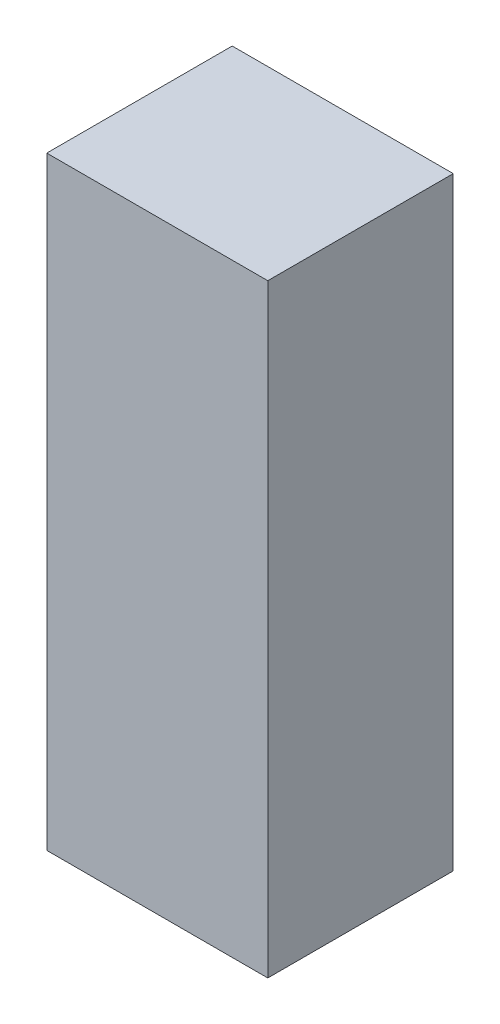
ISO-10303-21;
HEADER;
FILE_DESCRIPTION(('STEP AP214'),'2;1');
FILE_NAME('part.step','',(''),(''),'','','');
FILE_SCHEMA(('AUTOMOTIVE_DESIGN { 1 0 10303 214 1 1 1 1 }'));
ENDSEC;
DATA;
#1=APPLICATION_CONTEXT('core data for automotive mechanical design processes');
#2=APPLICATION_PROTOCOL_DEFINITION('international standard','automotive_design',2000,#1);
#3=PRODUCT_CONTEXT('',#1,'mechanical');
#4=PRODUCT('Part','Part','',(#3));
#5=PRODUCT_RELATED_PRODUCT_CATEGORY('part','',(#4));
#6=PRODUCT_DEFINITION_FORMATION('','',#4);
#7=PRODUCT_DEFINITION_CONTEXT('part definition',#1,'design');
#8=PRODUCT_DEFINITION('design','',#6,#7);
#9=PRODUCT_DEFINITION_SHAPE('','',#8);
#10=(LENGTH_UNIT() NAMED_UNIT(*) SI_UNIT(.MILLI.,.METRE.));
#11=(NAMED_UNIT(*) PLANE_ANGLE_UNIT() SI_UNIT($,.RADIAN.));
#12=(NAMED_UNIT(*) SI_UNIT($,.STERADIAN.) SOLID_ANGLE_UNIT());
#13=UNCERTAINTY_MEASURE_WITH_UNIT(LENGTH_MEASURE(1.E-05),#10,'distance_accuracy_value','');
#14=(GEOMETRIC_REPRESENTATION_CONTEXT(3) GLOBAL_UNCERTAINTY_ASSIGNED_CONTEXT((#13)) GLOBAL_UNIT_ASSIGNED_CONTEXT((#10,
#11,#12)) REPRESENTATION_CONTEXT('',''));
#15=CARTESIAN_POINT('',(0.,0.,0.));
#16=DIRECTION('',(0.,0.,1.));
#17=DIRECTION('',(1.,0.,0.));
#18=AXIS2_PLACEMENT_3D('',#15,#16,#17);
#19=CARTESIAN_POINT('',(2.735405575254,-1.119218528079,-5.5));
#20=DIRECTION('',(0.,0.,1.));
#21=DIRECTION('',(0.,-1.,0.));
#22=AXIS2_PLACEMENT_3D('',#19,#20,#21);
#23=PLANE('',#22);
#24=DIRECTION('',(1.,0.,0.));
#25=VECTOR('',#24,1.);
#26=CARTESIAN_POINT('',(2.139527219699,-2.747234350301,-5.5));
#27=LINE('',#26,#25);
#28=CARTESIAN_POINT('',(2.139527219699,-2.747234350301,-5.5));
#29=VERTEX_POINT('',#28);
#30=CARTESIAN_POINT('',(3.33128393081,-2.747234350301,-5.5));
#31=VERTEX_POINT('',#30);
#32=EDGE_CURVE('E78',#29,#31,#27,.T.);
#33=ORIENTED_EDGE('',*,*,#32,.T.);
#34=DIRECTION('',(0.,1.,0.));
#35=VECTOR('',#34,1.);
#36=CARTESIAN_POINT('',(3.33128393081,-2.747234350301,-5.5));
#37=LINE('',#36,#35);
#38=CARTESIAN_POINT('',(3.33128393081,0.508797294143,-5.5));
#39=VERTEX_POINT('',#38);
#40=EDGE_CURVE('E76',#31,#39,#37,.T.);
#41=ORIENTED_EDGE('',*,*,#40,.T.);
#42=DIRECTION('',(-1.,0.,0.));
#43=VECTOR('',#42,1.);
#44=CARTESIAN_POINT('',(3.33128393081,0.508797294143,-5.5));
#45=LINE('',#44,#43);
#46=CARTESIAN_POINT('',(2.139527219699,0.508797294143,-5.5));
#47=VERTEX_POINT('',#46);
#48=EDGE_CURVE('E63',#39,#47,#45,.T.);
#49=ORIENTED_EDGE('',*,*,#48,.T.);
#50=DIRECTION('',(0.,-1.,0.));
#51=VECTOR('',#50,1.);
#52=CARTESIAN_POINT('',(2.139527219699,0.508797294143,-5.5));
#53=LINE('',#52,#51);
#54=EDGE_CURVE('E11',#47,#29,#53,.T.);
#55=ORIENTED_EDGE('',*,*,#54,.T.);
#56=EDGE_LOOP('',(#33,#41,#49,#55));
#57=FACE_BOUND('',#56,.T.);
#58=ADVANCED_FACE('F16',(#57),#23,.T.);
#59=CARTESIAN_POINT('',(2.735405575254,-1.119218528079,-6.5));
#60=DIRECTION('',(0.,0.,1.));
#61=DIRECTION('',(0.,-1.,0.));
#62=AXIS2_PLACEMENT_3D('',#59,#60,#61);
#63=PLANE('',#62);
#64=DIRECTION('',(1.,0.,0.));
#65=VECTOR('',#64,1.);
#66=CARTESIAN_POINT('',(2.139527219699,-2.747234350301,-6.5));
#67=LINE('',#66,#65);
#68=CARTESIAN_POINT('',(2.139527219699,-2.747234350301,-6.5));
#69=VERTEX_POINT('',#68);
#70=CARTESIAN_POINT('',(3.33128393081,-2.747234350301,-6.5));
#71=VERTEX_POINT('',#70);
#72=EDGE_CURVE('E96',#69,#71,#67,.T.);
#73=ORIENTED_EDGE('',*,*,#72,.F.);
#74=DIRECTION('',(0.,-1.,0.));
#75=VECTOR('',#74,1.);
#76=CARTESIAN_POINT('',(2.139527219699,0.508797294143,-6.5));
#77=LINE('',#76,#75);
#78=CARTESIAN_POINT('',(2.139527219699,0.508797294143,-6.5));
#79=VERTEX_POINT('',#78);
#80=EDGE_CURVE('E20',#79,#69,#77,.T.);
#81=ORIENTED_EDGE('',*,*,#80,.F.);
#82=DIRECTION('',(-1.,0.,0.));
#83=VECTOR('',#82,1.);
#84=CARTESIAN_POINT('',(3.33128393081,0.508797294143,-6.5));
#85=LINE('',#84,#83);
#86=CARTESIAN_POINT('',(3.33128393081,0.508797294143,-6.5));
#87=VERTEX_POINT('',#86);
#88=EDGE_CURVE('E83',#87,#79,#85,.T.);
#89=ORIENTED_EDGE('',*,*,#88,.F.);
#90=DIRECTION('',(0.,1.,0.));
#91=VECTOR('',#90,1.);
#92=CARTESIAN_POINT('',(3.33128393081,-2.747234350301,-6.5));
#93=LINE('',#92,#91);
#94=EDGE_CURVE('E85',#71,#87,#93,.T.);
#95=ORIENTED_EDGE('',*,*,#94,.F.);
#96=EDGE_LOOP('',(#73,#81,#89,#95));
#97=FACE_BOUND('',#96,.T.);
#98=ADVANCED_FACE('F114',(#97),#63,.F.);
#99=CARTESIAN_POINT('',(2.139527219699,-1.119218528079,-5.49));
#100=DIRECTION('',(1.,0.,0.));
#101=DIRECTION('',(0.,0.,-1.));
#102=AXIS2_PLACEMENT_3D('',#99,#100,#101);
#103=PLANE('',#102);
#104=DIRECTION('',(0.,0.,1.));
#105=VECTOR('',#104,1.);
#106=CARTESIAN_POINT('',(2.139527219699,0.508797294143,-6.5));
#107=LINE('',#106,#105);
#108=EDGE_CURVE('E70',#79,#47,#107,.T.);
#109=ORIENTED_EDGE('',*,*,#108,.F.);
#110=ORIENTED_EDGE('',*,*,#80,.T.);
#111=DIRECTION('',(0.,0.,1.));
#112=VECTOR('',#111,1.);
#113=CARTESIAN_POINT('',(2.139527219699,-2.747234350301,-6.5));
#114=LINE('',#113,#112);
#115=EDGE_CURVE('E99',#69,#29,#114,.T.);
#116=ORIENTED_EDGE('',*,*,#115,.T.);
#117=ORIENTED_EDGE('',*,*,#54,.F.);
#118=EDGE_LOOP('',(#109,#110,#116,#117));
#119=FACE_BOUND('',#118,.T.);
#120=ADVANCED_FACE('F115',(#119),#103,.F.);
#121=CARTESIAN_POINT('',(2.7354055752545,0.508797294143,-5.49));
#122=DIRECTION('',(0.,-1.,0.));
#123=DIRECTION('',(0.,0.,1.));
#124=AXIS2_PLACEMENT_3D('',#121,#122,#123);
#125=PLANE('',#124);
#126=DIRECTION('',(0.,0.,1.));
#127=VECTOR('',#126,1.);
#128=CARTESIAN_POINT('',(3.33128393081,0.508797294143,-6.5));
#129=LINE('',#128,#127);
#130=EDGE_CURVE('E68',#87,#39,#129,.T.);
#131=ORIENTED_EDGE('',*,*,#130,.F.);
#132=ORIENTED_EDGE('',*,*,#88,.T.);
#133=ORIENTED_EDGE('',*,*,#108,.T.);
#134=ORIENTED_EDGE('',*,*,#48,.F.);
#135=EDGE_LOOP('',(#131,#132,#133,#134));
#136=FACE_BOUND('',#135,.T.);
#137=ADVANCED_FACE('F65',(#136),#125,.F.);
#138=CARTESIAN_POINT('',(3.33128393081,-1.119218528079,-5.49));
#139=DIRECTION('',(-1.,0.,0.));
#140=DIRECTION('',(0.,1.,0.));
#141=AXIS2_PLACEMENT_3D('',#138,#139,#140);
#142=PLANE('',#141);
#143=DIRECTION('',(0.,0.,1.));
#144=VECTOR('',#143,1.);
#145=CARTESIAN_POINT('',(3.33128393081,-2.747234350301,-6.5));
#146=LINE('',#145,#144);
#147=EDGE_CURVE('E94',#71,#31,#146,.T.);
#148=ORIENTED_EDGE('',*,*,#147,.F.);
#149=ORIENTED_EDGE('',*,*,#94,.T.);
#150=ORIENTED_EDGE('',*,*,#130,.T.);
#151=ORIENTED_EDGE('',*,*,#40,.F.);
#152=EDGE_LOOP('',(#148,#149,#150,#151));
#153=FACE_BOUND('',#152,.T.);
#154=ADVANCED_FACE('F18',(#153),#142,.F.);
#155=CARTESIAN_POINT('',(2.7354055752545,-2.747234350301,-5.49));
#156=DIRECTION('',(0.,1.,0.));
#157=DIRECTION('',(-1.,0.,0.));
#158=AXIS2_PLACEMENT_3D('',#155,#156,#157);
#159=PLANE('',#158);
#160=ORIENTED_EDGE('',*,*,#115,.F.);
#161=ORIENTED_EDGE('',*,*,#72,.T.);
#162=ORIENTED_EDGE('',*,*,#147,.T.);
#163=ORIENTED_EDGE('',*,*,#32,.F.);
#164=EDGE_LOOP('',(#160,#161,#162,#163));
#165=FACE_BOUND('',#164,.T.);
#166=ADVANCED_FACE('F129',(#165),#159,.F.);
#167=CLOSED_SHELL('',(#58,#98,#120,#137,#154,#166));
#168=MANIFOLD_SOLID_BREP('B1',#167);
#169=ADVANCED_BREP_SHAPE_REPRESENTATION('',(#18,#168),#14);
#170=SHAPE_DEFINITION_REPRESENTATION(#9,#169);
ENDSEC;
END-ISO-10303-21;
